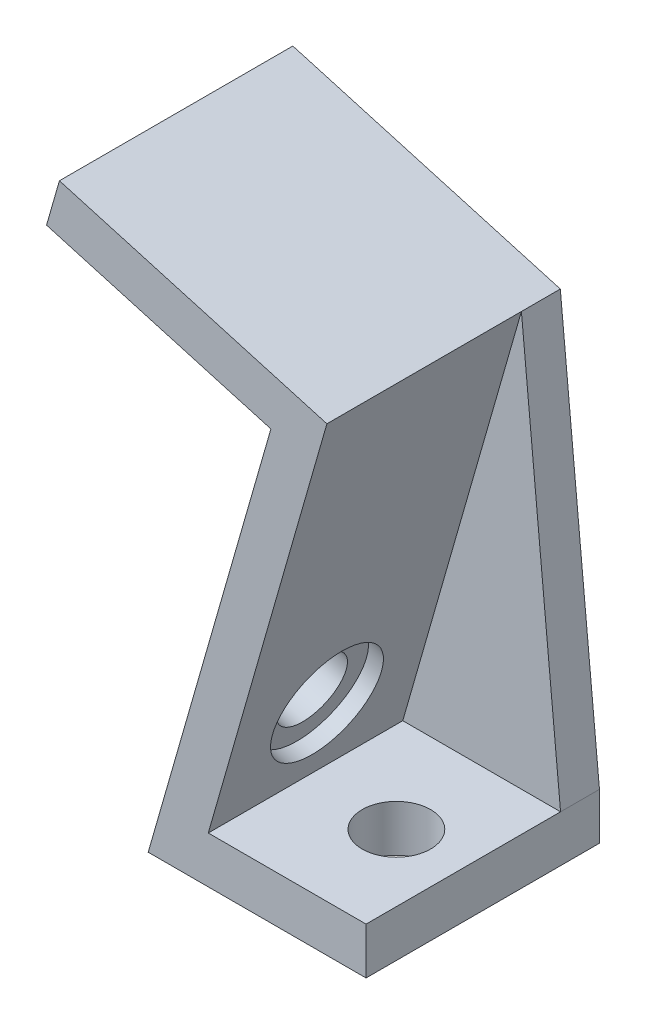
ISO-10303-21;
HEADER;
FILE_DESCRIPTION(('STEP AP214'),'2;1');
FILE_NAME('part.step','',(''),(''),'','','');
FILE_SCHEMA(('AUTOMOTIVE_DESIGN { 1 0 10303 214 1 1 1 1 }'));
ENDSEC;
DATA;
#1=APPLICATION_CONTEXT('core data for automotive mechanical design processes');
#2=APPLICATION_PROTOCOL_DEFINITION('international standard','automotive_design',2000,#1);
#3=PRODUCT_CONTEXT('',#1,'mechanical');
#4=PRODUCT('Part','Part','',(#3));
#5=PRODUCT_RELATED_PRODUCT_CATEGORY('part','',(#4));
#6=PRODUCT_DEFINITION_FORMATION('','',#4);
#7=PRODUCT_DEFINITION_CONTEXT('part definition',#1,'design');
#8=PRODUCT_DEFINITION('design','',#6,#7);
#9=PRODUCT_DEFINITION_SHAPE('','',#8);
#10=(LENGTH_UNIT() NAMED_UNIT(*) SI_UNIT(.MILLI.,.METRE.));
#11=(NAMED_UNIT(*) PLANE_ANGLE_UNIT() SI_UNIT($,.RADIAN.));
#12=(NAMED_UNIT(*) SI_UNIT($,.STERADIAN.) SOLID_ANGLE_UNIT());
#13=UNCERTAINTY_MEASURE_WITH_UNIT(LENGTH_MEASURE(1.E-05),#10,'distance_accuracy_value','');
#14=(GEOMETRIC_REPRESENTATION_CONTEXT(3) GLOBAL_UNCERTAINTY_ASSIGNED_CONTEXT((#13)) GLOBAL_UNIT_ASSIGNED_CONTEXT((#10,
#11,#12)) REPRESENTATION_CONTEXT('',''));
#15=CARTESIAN_POINT('',(0.,0.,0.));
#16=DIRECTION('',(0.,0.,1.));
#17=DIRECTION('',(1.,0.,0.));
#18=AXIS2_PLACEMENT_3D('',#15,#16,#17);
#19=CARTESIAN_POINT('',(-16.7494363496892,1.31983300267428,8.75));
#20=DIRECTION('',(0.96126169593832,-0.275637355816996,0.));
#21=DIRECTION('',(0.275637355816996,0.96126169593832,0.));
#22=AXIS2_PLACEMENT_3D('',#19,#20,#21);
#23=CYLINDRICAL_SURFACE('',#22,2.2);
#24=CARTESIAN_POINT('',(-9.90889153454056,-0.641661659145904,8.75));
#25=DIRECTION('',(0.961261695938318,-0.275637355817003,0.));
#26=DIRECTION('',(0.275637355817003,0.961261695938318,0.));
#27=AXIS2_PLACEMENT_3D('',#24,#25,#26);
#28=CIRCLE('',#27,2.2);
#29=CARTESIAN_POINT('',(-9.30248935174316,1.4731140719184,8.75));
#30=VERTEX_POINT('',#29);
#31=EDGE_CURVE('E181',#30,#30,#28,.T.);
#32=ORIENTED_EDGE('',*,*,#31,.F.);
#33=EDGE_LOOP('',(#32));
#34=FACE_BOUND('',#33,.T.);
#35=CARTESIAN_POINT('',(-8.0980810862443,-1.16090319967869,8.75));
#36=DIRECTION('',(0.96126169593832,-0.275637355816996,0.));
#37=DIRECTION('',(0.275637355816996,0.96126169593832,0.));
#38=AXIS2_PLACEMENT_3D('',#35,#36,#37);
#39=CIRCLE('',#38,2.2);
#40=CARTESIAN_POINT('',(-7.49167890344691,0.953872531385614,8.75));
#41=VERTEX_POINT('',#40);
#42=EDGE_CURVE('E42',#41,#41,#39,.F.);
#43=ORIENTED_EDGE('',*,*,#42,.F.);
#44=EDGE_LOOP('',(#43));
#45=FACE_BOUND('',#44,.T.);
#46=ADVANCED_FACE('F38',(#34,#45),#23,.F.);
#47=CARTESIAN_POINT('',(-12.3752423266674,-9.24284903518729,15.));
#48=DIRECTION('',(0.,1.,0.));
#49=DIRECTION('',(-1.,0.,0.));
#50=AXIS2_PLACEMENT_3D('',#47,#48,#49);
#51=PLANE('',#50);
#52=CARTESIAN_POINT('',(-2.67524232666738,-9.24284903518728,8.75));
#53=DIRECTION('',(0.,1.,0.));
#54=DIRECTION('',(-1.,0.,0.));
#55=AXIS2_PLACEMENT_3D('',#52,#53,#54);
#56=CIRCLE('',#55,2.2);
#57=CARTESIAN_POINT('',(-4.87524232666738,-9.24284903518728,8.75));
#58=VERTEX_POINT('',#57);
#59=EDGE_CURVE('E190',#58,#58,#56,.T.);
#60=ORIENTED_EDGE('',*,*,#59,.T.);
#61=EDGE_LOOP('',(#60));
#62=FACE_BOUND('',#61,.T.);
#63=DIRECTION('',(1.,0.,0.));
#64=VECTOR('',#63,1.);
#65=CARTESIAN_POINT('',(-12.3752423266674,-9.24284903518729,0.));
#66=LINE('',#65,#64);
#67=CARTESIAN_POINT('',(-12.3752423266674,-9.24284903518729,0.));
#68=VERTEX_POINT('',#67);
#69=CARTESIAN_POINT('',(1.62475767333262,-9.24284903518728,0.));
#70=VERTEX_POINT('',#69);
#71=EDGE_CURVE('E133',#68,#70,#66,.T.);
#72=ORIENTED_EDGE('',*,*,#71,.T.);
#73=DIRECTION('',(0.,0.,-1.));
#74=VECTOR('',#73,1.);
#75=CARTESIAN_POINT('',(1.62475767333262,-9.24284903518728,15.));
#76=LINE('',#75,#74);
#77=CARTESIAN_POINT('',(1.62475767333262,-9.24284903518728,15.));
#78=VERTEX_POINT('',#77);
#79=EDGE_CURVE('E11',#78,#70,#76,.T.);
#80=ORIENTED_EDGE('',*,*,#79,.F.);
#81=DIRECTION('',(1.,0.,0.));
#82=VECTOR('',#81,1.);
#83=CARTESIAN_POINT('',(-12.3752423266674,-9.24284903518729,15.));
#84=LINE('',#83,#82);
#85=CARTESIAN_POINT('',(-12.3752423266674,-9.24284903518729,15.));
#86=VERTEX_POINT('',#85);
#87=EDGE_CURVE('E120',#86,#78,#84,.T.);
#88=ORIENTED_EDGE('',*,*,#87,.F.);
#89=DIRECTION('',(0.,0.,-1.));
#90=VECTOR('',#89,1.);
#91=CARTESIAN_POINT('',(-12.3752423266674,-9.24284903518729,15.));
#92=LINE('',#91,#90);
#93=EDGE_CURVE('E134',#86,#68,#92,.T.);
#94=ORIENTED_EDGE('',*,*,#93,.T.);
#95=EDGE_LOOP('',(#72,#80,#88,#94));
#96=FACE_BOUND('',#95,.T.);
#97=ADVANCED_FACE('F40',(#62,#96),#51,.F.);
#98=CARTESIAN_POINT('',(1.62475767333262,-9.24284903518728,15.));
#99=DIRECTION('',(-1.,0.,0.));
#100=DIRECTION('',(0.,0.,1.));
#101=AXIS2_PLACEMENT_3D('',#98,#99,#100);
#102=PLANE('',#101);
#103=DIRECTION('',(0.,1.,0.));
#104=VECTOR('',#103,1.);
#105=CARTESIAN_POINT('',(1.62475767333262,-9.24284903518728,0.));
#106=LINE('',#105,#104);
#107=CARTESIAN_POINT('',(1.62475767333262,-6.24284903518728,0.));
#108=VERTEX_POINT('',#107);
#109=EDGE_CURVE('E138',#70,#108,#106,.T.);
#110=ORIENTED_EDGE('',*,*,#109,.T.);
#111=DIRECTION('',(0.,0.,-1.));
#112=VECTOR('',#111,1.);
#113=CARTESIAN_POINT('',(1.62475767333262,-6.24284903518728,2.5));
#114=LINE('',#113,#112);
#115=CARTESIAN_POINT('',(1.62475767333262,-6.24284903518728,2.5));
#116=VERTEX_POINT('',#115);
#117=EDGE_CURVE('E56',#116,#108,#114,.T.);
#118=ORIENTED_EDGE('',*,*,#117,.F.);
#119=DIRECTION('',(0.,0.,-1.));
#120=VECTOR('',#119,1.);
#121=CARTESIAN_POINT('',(1.62475767333262,-6.24284903518728,15.));
#122=LINE('',#121,#120);
#123=CARTESIAN_POINT('',(1.62475767333262,-6.24284903518728,15.));
#124=VERTEX_POINT('',#123);
#125=EDGE_CURVE('E48',#124,#116,#122,.T.);
#126=ORIENTED_EDGE('',*,*,#125,.F.);
#127=DIRECTION('',(0.,1.,0.));
#128=VECTOR('',#127,1.);
#129=CARTESIAN_POINT('',(1.62475767333262,-9.24284903518728,15.));
#130=LINE('',#129,#128);
#131=EDGE_CURVE('E111',#78,#124,#130,.T.);
#132=ORIENTED_EDGE('',*,*,#131,.F.);
#133=ORIENTED_EDGE('',*,*,#79,.T.);
#134=EDGE_LOOP('',(#110,#118,#126,#132,#133));
#135=FACE_BOUND('',#134,.T.);
#136=ADVANCED_FACE('F113',(#135),#102,.F.);
#137=CARTESIAN_POINT('',(1.62475767333262,-6.24284903518728,15.));
#138=DIRECTION('',(0.,-1.,0.));
#139=DIRECTION('',(1.,0.,0.));
#140=AXIS2_PLACEMENT_3D('',#137,#138,#139);
#141=PLANE('',#140);
#142=CARTESIAN_POINT('',(-2.67524232666738,-6.24284903518728,8.75));
#143=DIRECTION('',(0.,1.,0.));
#144=DIRECTION('',(-1.,0.,0.));
#145=AXIS2_PLACEMENT_3D('',#142,#143,#144);
#146=CIRCLE('',#145,2.2);
#147=CARTESIAN_POINT('',(-4.87524232666738,-6.24284903518728,8.75));
#148=VERTEX_POINT('',#147);
#149=EDGE_CURVE('E184',#148,#148,#146,.T.);
#150=ORIENTED_EDGE('',*,*,#149,.F.);
#151=EDGE_LOOP('',(#150));
#152=FACE_BOUND('',#151,.T.);
#153=ORIENTED_EDGE('',*,*,#125,.T.);
#154=DIRECTION('',(-1.,0.,0.));
#155=VECTOR('',#154,1.);
#156=CARTESIAN_POINT('',(1.62475767333262,-6.24284903518728,2.5));
#157=LINE('',#156,#155);
#158=CARTESIAN_POINT('',(-8.51500616939096,-6.24284903518729,2.5));
#159=VERTEX_POINT('',#158);
#160=EDGE_CURVE('E63',#116,#159,#157,.T.);
#161=ORIENTED_EDGE('',*,*,#160,.T.);
#162=DIRECTION('',(0.,0.,-1.));
#163=VECTOR('',#162,1.);
#164=CARTESIAN_POINT('',(-8.51500616939096,-6.24284903518729,15.));
#165=LINE('',#164,#163);
#166=CARTESIAN_POINT('',(-8.51500616939096,-6.24284903518729,15.));
#167=VERTEX_POINT('',#166);
#168=EDGE_CURVE('E177',#167,#159,#165,.T.);
#169=ORIENTED_EDGE('',*,*,#168,.F.);
#170=DIRECTION('',(-1.,0.,0.));
#171=VECTOR('',#170,1.);
#172=CARTESIAN_POINT('',(1.62475767333262,-6.24284903518728,15.));
#173=LINE('',#172,#171);
#174=EDGE_CURVE('E119',#124,#167,#173,.T.);
#175=ORIENTED_EDGE('',*,*,#174,.F.);
#176=EDGE_LOOP('',(#153,#161,#169,#175));
#177=FACE_BOUND('',#176,.T.);
#178=ADVANCED_FACE('F267',(#152,#177),#141,.F.);
#179=CARTESIAN_POINT('',(-8.51500616939096,-6.24284903518729,15.));
#180=DIRECTION('',(-0.96126169593832,0.275637355816996,0.));
#181=DIRECTION('',(-0.275637355816996,-0.96126169593832,0.));
#182=AXIS2_PLACEMENT_3D('',#179,#180,#181);
#183=PLANE('',#182);
#184=CARTESIAN_POINT('',(-7.13681939030598,-1.43654055549569,8.75));
#185=DIRECTION('',(0.96126169593832,-0.275637355816996,0.));
#186=DIRECTION('',(0.275637355816996,0.96126169593832,0.));
#187=AXIS2_PLACEMENT_3D('',#184,#185,#186);
#188=CIRCLE('',#187,3.5);
#189=CARTESIAN_POINT('',(-6.1720886449465,1.92787538028843,8.75));
#190=VERTEX_POINT('',#189);
#191=EDGE_CURVE('E198',#190,#190,#188,.T.);
#192=ORIENTED_EDGE('',*,*,#191,.F.);
#193=EDGE_LOOP('',(#192));
#194=FACE_BOUND('',#193,.T.);
#195=ORIENTED_EDGE('',*,*,#168,.T.);
#196=DIRECTION('',(0.275637355816996,0.96126169593832,0.));
#197=VECTOR('',#196,1.);
#198=CARTESIAN_POINT('',(-8.51500616939096,-6.24284903518729,2.5));
#199=LINE('',#198,#197);
#200=CARTESIAN_POINT('',(-0.890760006614613,20.3460571562779,2.5));
#201=VERTEX_POINT('',#200);
#202=EDGE_CURVE('E210',#159,#201,#199,.T.);
#203=ORIENTED_EDGE('',*,*,#202,.T.);
#204=DIRECTION('',(0.,0.,-1.));
#205=VECTOR('',#204,1.);
#206=CARTESIAN_POINT('',(-0.890760006614613,20.3460571562779,15.));
#207=LINE('',#206,#205);
#208=CARTESIAN_POINT('',(-0.890760006614613,20.3460571562779,15.));
#209=VERTEX_POINT('',#208);
#210=EDGE_CURVE('E173',#209,#201,#207,.T.);
#211=ORIENTED_EDGE('',*,*,#210,.F.);
#212=DIRECTION('',(0.275637355816996,0.96126169593832,0.));
#213=VECTOR('',#212,1.);
#214=CARTESIAN_POINT('',(-8.51500616939096,-6.24284903518729,15.));
#215=LINE('',#214,#213);
#216=EDGE_CURVE('E226',#167,#209,#215,.T.);
#217=ORIENTED_EDGE('',*,*,#216,.F.);
#218=EDGE_LOOP('',(#195,#203,#211,#217));
#219=FACE_BOUND('',#218,.T.);
#220=ADVANCED_FACE('F265',(#194,#219),#183,.F.);
#221=CARTESIAN_POINT('',(-0.890760006614613,20.3460571562779,15.));
#222=DIRECTION('',(-0.275637355816996,-0.96126169593832,0.));
#223=DIRECTION('',(0.96126169593832,-0.275637355816996,0.));
#224=AXIS2_PLACEMENT_3D('',#221,#222,#223);
#225=PLANE('',#224);
#226=DIRECTION('',(-0.96126169593832,0.275637355816996,0.));
#227=VECTOR('',#226,1.);
#228=CARTESIAN_POINT('',(-0.890760006614613,20.3460571562779,0.));
#229=LINE('',#228,#227);
#230=CARTESIAN_POINT('',(-0.890760006614613,20.3460571562779,0.));
#231=VERTEX_POINT('',#230);
#232=CARTESIAN_POINT('',(-18.0817575899239,25.2754963898826,0.));
#233=VERTEX_POINT('',#232);
#234=EDGE_CURVE('E142',#231,#233,#229,.T.);
#235=ORIENTED_EDGE('',*,*,#234,.T.);
#236=DIRECTION('',(0.,0.,-1.));
#237=VECTOR('',#236,1.);
#238=CARTESIAN_POINT('',(-18.0817575899239,25.2754963898826,15.));
#239=LINE('',#238,#237);
#240=CARTESIAN_POINT('',(-18.0817575899239,25.2754963898826,15.));
#241=VERTEX_POINT('',#240);
#242=EDGE_CURVE('E169',#241,#233,#239,.T.);
#243=ORIENTED_EDGE('',*,*,#242,.F.);
#244=DIRECTION('',(-0.96126169593832,0.275637355816996,0.));
#245=VECTOR('',#244,1.);
#246=CARTESIAN_POINT('',(-0.890760006614613,20.3460571562779,15.));
#247=LINE('',#246,#245);
#248=EDGE_CURVE('E229',#209,#241,#247,.T.);
#249=ORIENTED_EDGE('',*,*,#248,.F.);
#250=ORIENTED_EDGE('',*,*,#210,.T.);
#251=DIRECTION('',(0.,0.,-1.));
#252=VECTOR('',#251,1.);
#253=CARTESIAN_POINT('',(-0.890760006614613,20.3460571562779,2.5));
#254=LINE('',#253,#252);
#255=EDGE_CURVE('E144',#201,#231,#254,.T.);
#256=ORIENTED_EDGE('',*,*,#255,.T.);
#257=EDGE_LOOP('',(#235,#243,#249,#250,#256));
#258=FACE_BOUND('',#257,.T.);
#259=ADVANCED_FACE('F255',(#258),#225,.F.);
#260=CARTESIAN_POINT('',(-18.9086696573748,22.3917113020678,15.));
#261=DIRECTION('',(0.96126169593832,-0.275637355816996,0.));
#262=DIRECTION('',(0.275637355816996,0.96126169593832,0.));
#263=AXIS2_PLACEMENT_3D('',#260,#261,#262);
#264=PLANE('',#263);
#265=DIRECTION('',(-0.275637355816996,-0.96126169593832,0.));
#266=VECTOR('',#265,1.);
#267=CARTESIAN_POINT('',(-18.9086696573748,22.3917113020678,0.));
#268=LINE('',#267,#266);
#269=CARTESIAN_POINT('',(-18.9086696573748,22.3917113020678,0.));
#270=VERTEX_POINT('',#269);
#271=EDGE_CURVE('E151',#233,#270,#268,.T.);
#272=ORIENTED_EDGE('',*,*,#271,.T.);
#273=DIRECTION('',(0.,0.,-1.));
#274=VECTOR('',#273,1.);
#275=CARTESIAN_POINT('',(-18.9086696573748,22.3917113020678,15.));
#276=LINE('',#275,#274);
#277=CARTESIAN_POINT('',(-18.9086696573748,22.3917113020678,15.));
#278=VERTEX_POINT('',#277);
#279=EDGE_CURVE('E165',#278,#270,#276,.T.);
#280=ORIENTED_EDGE('',*,*,#279,.F.);
#281=DIRECTION('',(-0.275637355816996,-0.96126169593832,0.));
#282=VECTOR('',#281,1.);
#283=CARTESIAN_POINT('',(-18.9086696573748,22.3917113020678,15.));
#284=LINE('',#283,#282);
#285=EDGE_CURVE('E232',#241,#278,#284,.T.);
#286=ORIENTED_EDGE('',*,*,#285,.F.);
#287=ORIENTED_EDGE('',*,*,#242,.T.);
#288=EDGE_LOOP('',(#272,#280,#286,#287));
#289=FACE_BOUND('',#288,.T.);
#290=ADVANCED_FACE('F251',(#289),#264,.F.);
#291=CARTESIAN_POINT('',(-4.48974421830004,18.2571509648127,15.));
#292=DIRECTION('',(0.275637355817006,0.961261695938317,0.));
#293=DIRECTION('',(-0.961261695938317,0.275637355817006,0.));
#294=AXIS2_PLACEMENT_3D('',#291,#292,#293);
#295=PLANE('',#294);
#296=DIRECTION('',(0.961261695938317,-0.275637355817006,0.));
#297=VECTOR('',#296,1.);
#298=CARTESIAN_POINT('',(-4.48974421830004,18.2571509648127,0.));
#299=LINE('',#298,#297);
#300=CARTESIAN_POINT('',(-4.48974421830004,18.2571509648127,0.));
#301=VERTEX_POINT('',#300);
#302=EDGE_CURVE('E154',#270,#301,#299,.T.);
#303=ORIENTED_EDGE('',*,*,#302,.T.);
#304=DIRECTION('',(0.,0.,-1.));
#305=VECTOR('',#304,1.);
#306=CARTESIAN_POINT('',(-4.48974421830004,18.2571509648127,15.));
#307=LINE('',#306,#305);
#308=CARTESIAN_POINT('',(-4.48974421830004,18.2571509648127,15.));
#309=VERTEX_POINT('',#308);
#310=EDGE_CURVE('E161',#309,#301,#307,.T.);
#311=ORIENTED_EDGE('',*,*,#310,.F.);
#312=DIRECTION('',(0.961261695938317,-0.275637355817006,0.));
#313=VECTOR('',#312,1.);
#314=CARTESIAN_POINT('',(-4.48974421830004,18.2571509648127,15.));
#315=LINE('',#314,#313);
#316=EDGE_CURVE('E234',#278,#309,#315,.T.);
#317=ORIENTED_EDGE('',*,*,#316,.F.);
#318=ORIENTED_EDGE('',*,*,#279,.T.);
#319=EDGE_LOOP('',(#303,#311,#317,#318));
#320=FACE_BOUND('',#319,.T.);
#321=ADVANCED_FACE('F242',(#320),#295,.F.);
#322=CARTESIAN_POINT('',(-4.48974421830004,18.2571509648127,15.));
#323=DIRECTION('',(0.961261695938318,-0.275637355817003,0.));
#324=DIRECTION('',(0.275637355817003,0.961261695938318,0.));
#325=AXIS2_PLACEMENT_3D('',#322,#323,#324);
#326=PLANE('',#325);
#327=ORIENTED_EDGE('',*,*,#31,.T.);
#328=EDGE_LOOP('',(#327));
#329=FACE_BOUND('',#328,.T.);
#330=DIRECTION('',(-0.275637355817003,-0.961261695938318,0.));
#331=VECTOR('',#330,1.);
#332=CARTESIAN_POINT('',(-4.48974421830004,18.2571509648127,0.));
#333=LINE('',#332,#331);
#334=EDGE_CURVE('E130',#301,#68,#333,.T.);
#335=ORIENTED_EDGE('',*,*,#334,.T.);
#336=ORIENTED_EDGE('',*,*,#93,.F.);
#337=DIRECTION('',(-0.275637355817003,-0.961261695938318,0.));
#338=VECTOR('',#337,1.);
#339=CARTESIAN_POINT('',(-4.48974421830004,18.2571509648127,15.));
#340=LINE('',#339,#338);
#341=EDGE_CURVE('E125',#309,#86,#340,.T.);
#342=ORIENTED_EDGE('',*,*,#341,.F.);
#343=ORIENTED_EDGE('',*,*,#310,.T.);
#344=EDGE_LOOP('',(#335,#336,#342,#343));
#345=FACE_BOUND('',#344,.T.);
#346=ADVANCED_FACE('F245',(#329,#345),#326,.F.);
#347=CARTESIAN_POINT('',(0.,0.,15.));
#348=DIRECTION('',(0.,0.,1.));
#349=DIRECTION('',(1.,0.,0.));
#350=AXIS2_PLACEMENT_3D('',#347,#348,#349);
#351=PLANE('',#350);
#352=ORIENTED_EDGE('',*,*,#87,.T.);
#353=ORIENTED_EDGE('',*,*,#131,.T.);
#354=ORIENTED_EDGE('',*,*,#174,.T.);
#355=ORIENTED_EDGE('',*,*,#216,.T.);
#356=ORIENTED_EDGE('',*,*,#248,.T.);
#357=ORIENTED_EDGE('',*,*,#285,.T.);
#358=ORIENTED_EDGE('',*,*,#316,.T.);
#359=ORIENTED_EDGE('',*,*,#341,.T.);
#360=EDGE_LOOP('',(#352,#353,#354,#355,#356,#357,#358,#359));
#361=FACE_BOUND('',#360,.T.);
#362=ADVANCED_FACE('F123',(#361),#351,.T.);
#363=CARTESIAN_POINT('',(0.,0.,0.));
#364=DIRECTION('',(0.,0.,1.));
#365=DIRECTION('',(1.,0.,0.));
#366=AXIS2_PLACEMENT_3D('',#363,#364,#365);
#367=PLANE('',#366);
#368=ORIENTED_EDGE('',*,*,#234,.F.);
#369=DIRECTION('',(0.0941872123790143,-0.995554503291643,0.));
#370=VECTOR('',#369,1.);
#371=CARTESIAN_POINT('',(-0.890760006614613,20.3460571562779,0.));
#372=LINE('',#371,#370);
#373=EDGE_CURVE('E209',#231,#108,#372,.T.);
#374=ORIENTED_EDGE('',*,*,#373,.T.);
#375=ORIENTED_EDGE('',*,*,#109,.F.);
#376=ORIENTED_EDGE('',*,*,#71,.F.);
#377=ORIENTED_EDGE('',*,*,#334,.F.);
#378=ORIENTED_EDGE('',*,*,#302,.F.);
#379=ORIENTED_EDGE('',*,*,#271,.F.);
#380=EDGE_LOOP('',(#368,#374,#375,#376,#377,#378,#379));
#381=FACE_BOUND('',#380,.T.);
#382=ADVANCED_FACE('F247',(#381),#367,.F.);
#383=CARTESIAN_POINT('',(-0.890760006614613,20.3460571562779,2.5));
#384=DIRECTION('',(0.995554503291643,0.0941872123790143,0.));
#385=DIRECTION('',(-0.0941872123790143,0.995554503291643,0.));
#386=AXIS2_PLACEMENT_3D('',#383,#384,#385);
#387=PLANE('',#386);
#388=ORIENTED_EDGE('',*,*,#373,.F.);
#389=ORIENTED_EDGE('',*,*,#255,.F.);
#390=DIRECTION('',(0.0941872123790143,-0.995554503291643,0.));
#391=VECTOR('',#390,1.);
#392=CARTESIAN_POINT('',(-0.890760006614613,20.3460571562779,2.5));
#393=LINE('',#392,#391);
#394=EDGE_CURVE('E213',#201,#116,#393,.T.);
#395=ORIENTED_EDGE('',*,*,#394,.T.);
#396=ORIENTED_EDGE('',*,*,#117,.T.);
#397=EDGE_LOOP('',(#388,#389,#395,#396));
#398=FACE_BOUND('',#397,.T.);
#399=ADVANCED_FACE('F260',(#398),#387,.T.);
#400=CARTESIAN_POINT('',(0.,0.,2.5));
#401=DIRECTION('',(0.,0.,1.));
#402=DIRECTION('',(1.,0.,0.));
#403=AXIS2_PLACEMENT_3D('',#400,#401,#402);
#404=PLANE('',#403);
#405=ORIENTED_EDGE('',*,*,#202,.F.);
#406=ORIENTED_EDGE('',*,*,#160,.F.);
#407=ORIENTED_EDGE('',*,*,#394,.F.);
#408=EDGE_LOOP('',(#405,#406,#407));
#409=FACE_BOUND('',#408,.T.);
#410=ADVANCED_FACE('F263',(#409),#404,.T.);
#411=CARTESIAN_POINT('',(-2.67524232666738,-16.2428490351873,8.75));
#412=DIRECTION('',(0.,1.,0.));
#413=DIRECTION('',(-1.,0.,0.));
#414=AXIS2_PLACEMENT_3D('',#411,#412,#413);
#415=CYLINDRICAL_SURFACE('',#414,2.2);
#416=ORIENTED_EDGE('',*,*,#149,.T.);
#417=EDGE_LOOP('',(#416));
#418=FACE_BOUND('',#417,.T.);
#419=ORIENTED_EDGE('',*,*,#59,.F.);
#420=EDGE_LOOP('',(#419));
#421=FACE_BOUND('',#420,.T.);
#422=ADVANCED_FACE('F293',(#418,#421),#415,.F.);
#423=CARTESIAN_POINT('',(-8.0980810862443,-1.16090319967869,8.75));
#424=DIRECTION('',(0.96126169593832,-0.275637355816996,0.));
#425=DIRECTION('',(0.275637355816996,0.96126169593832,0.));
#426=AXIS2_PLACEMENT_3D('',#423,#424,#425);
#427=PLANE('',#426);
#428=CARTESIAN_POINT('',(-8.0980810862443,-1.16090319967869,8.75));
#429=DIRECTION('',(0.96126169593832,-0.275637355816996,0.));
#430=DIRECTION('',(0.275637355816996,0.96126169593832,0.));
#431=AXIS2_PLACEMENT_3D('',#428,#429,#430);
#432=CIRCLE('',#431,3.5);
#433=CARTESIAN_POINT('',(-7.13335034088482,2.20351273610543,8.75));
#434=VERTEX_POINT('',#433);
#435=EDGE_CURVE('E193',#434,#434,#432,.T.);
#436=ORIENTED_EDGE('',*,*,#435,.T.);
#437=EDGE_LOOP('',(#436));
#438=FACE_BOUND('',#437,.T.);
#439=ORIENTED_EDGE('',*,*,#42,.T.);
#440=EDGE_LOOP('',(#439));
#441=FACE_BOUND('',#440,.T.);
#442=ADVANCED_FACE('F295',(#438,#441),#427,.T.);
#443=CARTESIAN_POINT('',(-8.0980810862443,-1.16090319967869,8.75));
#444=DIRECTION('',(0.96126169593832,-0.275637355816996,0.));
#445=DIRECTION('',(0.275637355816996,0.96126169593832,0.));
#446=AXIS2_PLACEMENT_3D('',#443,#444,#445);
#447=CYLINDRICAL_SURFACE('',#446,3.5);
#448=ORIENTED_EDGE('',*,*,#435,.F.);
#449=EDGE_LOOP('',(#448));
#450=FACE_BOUND('',#449,.T.);
#451=ORIENTED_EDGE('',*,*,#191,.T.);
#452=EDGE_LOOP('',(#451));
#453=FACE_BOUND('',#452,.T.);
#454=ADVANCED_FACE('F291',(#450,#453),#447,.F.);
#455=CLOSED_SHELL('',(#46,#97,#136,#178,#220,#259,#290,#321,#346,#362,#382,#399,#410,#422,#442,#454));
#456=MANIFOLD_SOLID_BREP('B2',#455);
#457=ADVANCED_BREP_SHAPE_REPRESENTATION('',(#18,#456),#14);
#458=SHAPE_DEFINITION_REPRESENTATION(#9,#457);
ENDSEC;
END-ISO-10303-21;
